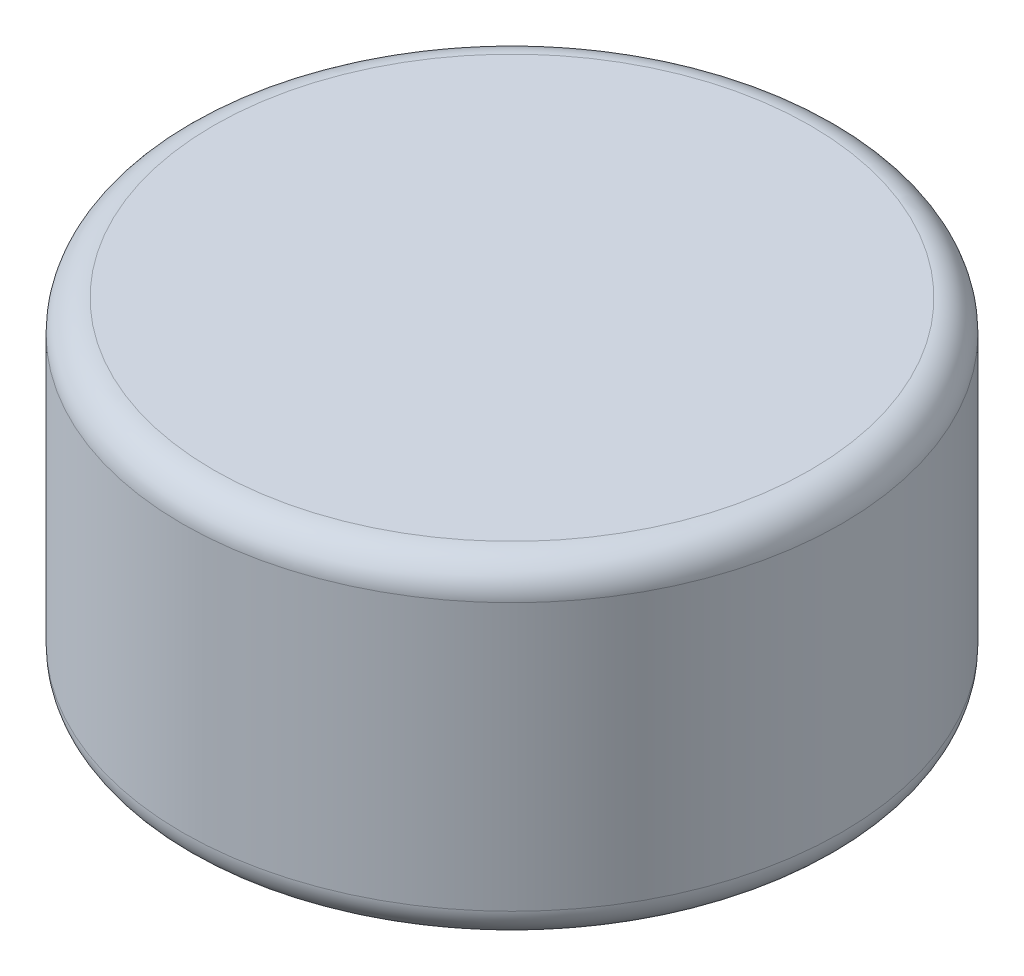
ISO-10303-21;
HEADER;
FILE_DESCRIPTION(('STEP AP214'),'2;1');
FILE_NAME('part.step','',(''),(''),'','','');
FILE_SCHEMA(('AUTOMOTIVE_DESIGN { 1 0 10303 214 1 1 1 1 }'));
ENDSEC;
DATA;
#1=APPLICATION_CONTEXT('core data for automotive mechanical design processes');
#2=APPLICATION_PROTOCOL_DEFINITION('international standard','automotive_design',2000,#1);
#3=PRODUCT_CONTEXT('',#1,'mechanical');
#4=PRODUCT('Part','Part','',(#3));
#5=PRODUCT_RELATED_PRODUCT_CATEGORY('part','',(#4));
#6=PRODUCT_DEFINITION_FORMATION('','',#4);
#7=PRODUCT_DEFINITION_CONTEXT('part definition',#1,'design');
#8=PRODUCT_DEFINITION('design','',#6,#7);
#9=PRODUCT_DEFINITION_SHAPE('','',#8);
#10=(LENGTH_UNIT() NAMED_UNIT(*) SI_UNIT(.MILLI.,.METRE.));
#11=(NAMED_UNIT(*) PLANE_ANGLE_UNIT() SI_UNIT($,.RADIAN.));
#12=(NAMED_UNIT(*) SI_UNIT($,.STERADIAN.) SOLID_ANGLE_UNIT());
#13=UNCERTAINTY_MEASURE_WITH_UNIT(LENGTH_MEASURE(1.E-05),#10,'distance_accuracy_value','');
#14=(GEOMETRIC_REPRESENTATION_CONTEXT(3) GLOBAL_UNCERTAINTY_ASSIGNED_CONTEXT((#13)) GLOBAL_UNIT_ASSIGNED_CONTEXT((#10,
#11,#12)) REPRESENTATION_CONTEXT('',''));
#15=CARTESIAN_POINT('',(0.,0.,0.));
#16=DIRECTION('',(0.,0.,1.));
#17=DIRECTION('',(1.,0.,0.));
#18=AXIS2_PLACEMENT_3D('',#15,#16,#17);
#19=CARTESIAN_POINT('',(0.,3.175,0.));
#20=DIRECTION('',(0.,-1.,0.));
#21=DIRECTION('',(1.,0.,0.));
#22=AXIS2_PLACEMENT_3D('',#19,#20,#21);
#23=PLANE('',#22);
#24=CARTESIAN_POINT('',(0.,3.175,0.));
#25=DIRECTION('',(0.,-1.,0.));
#26=DIRECTION('',(1.,0.,0.));
#27=AXIS2_PLACEMENT_3D('',#24,#25,#26);
#28=CIRCLE('',#27,2.875);
#29=CARTESIAN_POINT('',(2.875,3.175,0.));
#30=VERTEX_POINT('',#29);
#31=EDGE_CURVE('E10',#30,#30,#28,.F.);
#32=ORIENTED_EDGE('',*,*,#31,.T.);
#33=EDGE_LOOP('',(#32));
#34=FACE_BOUND('',#33,.T.);
#35=ADVANCED_FACE('F37',(#34),#23,.F.);
#36=CARTESIAN_POINT('',(0.,0.,0.));
#37=DIRECTION('',(0.,-1.,0.));
#38=DIRECTION('',(1.,0.,0.));
#39=AXIS2_PLACEMENT_3D('',#36,#37,#38);
#40=CYLINDRICAL_SURFACE('',#39,3.175);
#41=CARTESIAN_POINT('',(0.,0.3,0.));
#42=DIRECTION('',(0.,1.,0.));
#43=DIRECTION('',(-1.,0.,0.));
#44=AXIS2_PLACEMENT_3D('',#41,#42,#43);
#45=CIRCLE('',#44,3.175);
#46=CARTESIAN_POINT('',(-3.175,0.3,0.));
#47=VERTEX_POINT('',#46);
#48=EDGE_CURVE('E44',#47,#47,#45,.T.);
#49=ORIENTED_EDGE('',*,*,#48,.T.);
#50=EDGE_LOOP('',(#49));
#51=FACE_BOUND('',#50,.T.);
#52=CARTESIAN_POINT('',(0.,2.875,0.));
#53=DIRECTION('',(0.,-1.,0.));
#54=DIRECTION('',(1.,0.,0.));
#55=AXIS2_PLACEMENT_3D('',#52,#53,#54);
#56=CIRCLE('',#55,3.175);
#57=CARTESIAN_POINT('',(3.175,2.875,0.));
#58=VERTEX_POINT('',#57);
#59=EDGE_CURVE('E48',#58,#58,#56,.T.);
#60=ORIENTED_EDGE('',*,*,#59,.T.);
#61=EDGE_LOOP('',(#60));
#62=FACE_BOUND('',#61,.T.);
#63=ADVANCED_FACE('F68',(#51,#62),#40,.T.);
#64=CARTESIAN_POINT('',(0.,0.,0.));
#65=DIRECTION('',(0.,1.,0.));
#66=DIRECTION('',(-1.,0.,0.));
#67=AXIS2_PLACEMENT_3D('',#64,#65,#66);
#68=PLANE('',#67);
#69=CARTESIAN_POINT('',(0.,0.,0.));
#70=DIRECTION('',(0.,1.,0.));
#71=DIRECTION('',(-1.,0.,0.));
#72=AXIS2_PLACEMENT_3D('',#69,#70,#71);
#73=CIRCLE('',#72,2.875);
#74=CARTESIAN_POINT('',(-2.875,0.,0.));
#75=VERTEX_POINT('',#74);
#76=EDGE_CURVE('E52',#75,#75,#73,.F.);
#77=ORIENTED_EDGE('',*,*,#76,.T.);
#78=EDGE_LOOP('',(#77));
#79=FACE_BOUND('',#78,.T.);
#80=ADVANCED_FACE('F58',(#79),#68,.F.);
#81=CARTESIAN_POINT('',(0.,0.3,0.));
#82=DIRECTION('',(0.,1.,0.));
#83=DIRECTION('',(-1.,0.,0.));
#84=AXIS2_PLACEMENT_3D('',#81,#82,#83);
#85=TOROIDAL_SURFACE('',#84,2.875,0.3);
#86=ORIENTED_EDGE('',*,*,#48,.F.);
#87=EDGE_LOOP('',(#86));
#88=FACE_BOUND('',#87,.T.);
#89=ORIENTED_EDGE('',*,*,#76,.F.);
#90=EDGE_LOOP('',(#89));
#91=FACE_BOUND('',#90,.T.);
#92=ADVANCED_FACE('F60',(#88,#91),#85,.T.);
#93=CARTESIAN_POINT('',(0.,2.875,0.));
#94=DIRECTION('',(0.,-1.,0.));
#95=DIRECTION('',(1.,0.,0.));
#96=AXIS2_PLACEMENT_3D('',#93,#94,#95);
#97=TOROIDAL_SURFACE('',#96,2.875,0.3);
#98=ORIENTED_EDGE('',*,*,#31,.F.);
#99=EDGE_LOOP('',(#98));
#100=FACE_BOUND('',#99,.T.);
#101=ORIENTED_EDGE('',*,*,#59,.F.);
#102=EDGE_LOOP('',(#101));
#103=FACE_BOUND('',#102,.T.);
#104=ADVANCED_FACE('F39',(#100,#103),#97,.T.);
#105=CLOSED_SHELL('',(#35,#63,#80,#92,#104));
#106=MANIFOLD_SOLID_BREP('B2',#105);
#107=ADVANCED_BREP_SHAPE_REPRESENTATION('',(#18,#106),#14);
#108=SHAPE_DEFINITION_REPRESENTATION(#9,#107);
ENDSEC;
END-ISO-10303-21;
